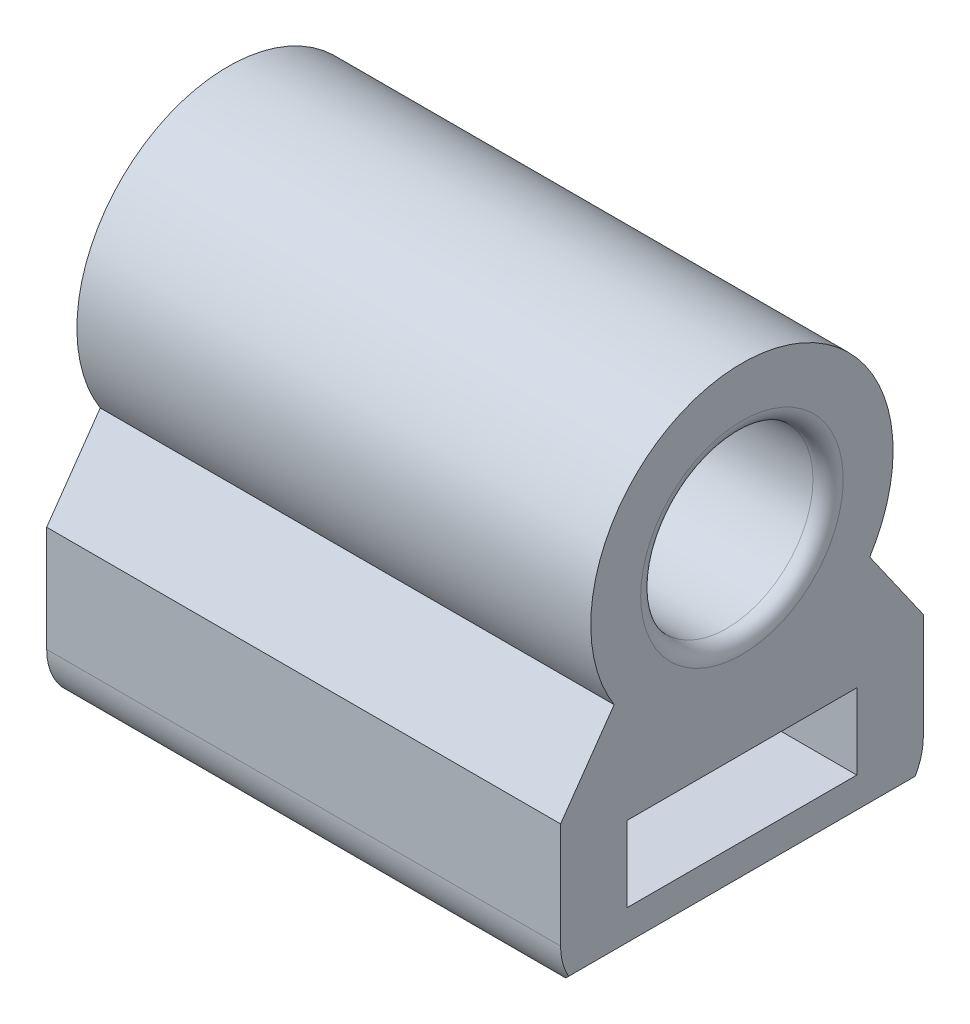
ISO-10303-21;
HEADER;
FILE_DESCRIPTION(('STEP AP214'),'2;1');
FILE_NAME('part.step','',(''),(''),'','','');
FILE_SCHEMA(('AUTOMOTIVE_DESIGN { 1 0 10303 214 1 1 1 1 }'));
ENDSEC;
DATA;
#1=APPLICATION_CONTEXT('core data for automotive mechanical design processes');
#2=APPLICATION_PROTOCOL_DEFINITION('international standard','automotive_design',2000,#1);
#3=PRODUCT_CONTEXT('',#1,'mechanical');
#4=PRODUCT('Part','Part','',(#3));
#5=PRODUCT_RELATED_PRODUCT_CATEGORY('part','',(#4));
#6=PRODUCT_DEFINITION_FORMATION('','',#4);
#7=PRODUCT_DEFINITION_CONTEXT('part definition',#1,'design');
#8=PRODUCT_DEFINITION('design','',#6,#7);
#9=PRODUCT_DEFINITION_SHAPE('','',#8);
#10=(LENGTH_UNIT() NAMED_UNIT(*) SI_UNIT(.MILLI.,.METRE.));
#11=(NAMED_UNIT(*) PLANE_ANGLE_UNIT() SI_UNIT($,.RADIAN.));
#12=(NAMED_UNIT(*) SI_UNIT($,.STERADIAN.) SOLID_ANGLE_UNIT());
#13=UNCERTAINTY_MEASURE_WITH_UNIT(LENGTH_MEASURE(1.E-05),#10,'distance_accuracy_value','');
#14=(GEOMETRIC_REPRESENTATION_CONTEXT(3) GLOBAL_UNCERTAINTY_ASSIGNED_CONTEXT((#13)) GLOBAL_UNIT_ASSIGNED_CONTEXT((#10,
#11,#12)) REPRESENTATION_CONTEXT('',''));
#15=CARTESIAN_POINT('',(0.,0.,0.));
#16=DIRECTION('',(0.,0.,1.));
#17=DIRECTION('',(1.,0.,0.));
#18=AXIS2_PLACEMENT_3D('',#15,#16,#17);
#19=CARTESIAN_POINT('',(0.,2.,0.));
#20=DIRECTION('',(0.,1.,0.));
#21=DIRECTION('',(0.,0.,1.));
#22=AXIS2_PLACEMENT_3D('',#19,#20,#21);
#23=PLANE('',#22);
#24=CARTESIAN_POINT('',(2.5,2.,0.));
#25=DIRECTION('',(0.,1.,0.));
#26=DIRECTION('',(0.,0.,1.));
#27=AXIS2_PLACEMENT_3D('',#24,#25,#26);
#28=CIRCLE('',#27,1.);
#29=CARTESIAN_POINT('',(2.5,2.,1.));
#30=VERTEX_POINT('',#29);
#31=EDGE_CURVE('E209',#30,#30,#28,.T.);
#32=ORIENTED_EDGE('',*,*,#31,.F.);
#33=EDGE_LOOP('',(#32));
#34=FACE_BOUND('',#33,.T.);
#35=CARTESIAN_POINT('',(-2.5,2.,0.));
#36=DIRECTION('',(0.,1.,0.));
#37=DIRECTION('',(0.,0.,1.));
#38=AXIS2_PLACEMENT_3D('',#35,#36,#37);
#39=CIRCLE('',#38,1.);
#40=CARTESIAN_POINT('',(-2.5,2.,1.));
#41=VERTEX_POINT('',#40);
#42=EDGE_CURVE('E212',#41,#41,#39,.T.);
#43=ORIENTED_EDGE('',*,*,#42,.F.);
#44=EDGE_LOOP('',(#43));
#45=FACE_BOUND('',#44,.T.);
#46=DIRECTION('',(0.,0.,1.));
#47=VECTOR('',#46,1.);
#48=CARTESIAN_POINT('',(-11.,2.,0.));
#49=LINE('',#48,#47);
#50=CARTESIAN_POINT('',(-11.,2.,-3.8));
#51=VERTEX_POINT('',#50);
#52=CARTESIAN_POINT('',(-11.,2.,3.8));
#53=VERTEX_POINT('',#52);
#54=EDGE_CURVE('E218',#51,#53,#49,.T.);
#55=ORIENTED_EDGE('',*,*,#54,.T.);
#56=DIRECTION('',(-1.,0.,0.));
#57=VECTOR('',#56,1.);
#58=CARTESIAN_POINT('',(6.,2.,3.8));
#59=LINE('',#58,#57);
#60=CARTESIAN_POINT('',(6.,2.,3.8));
#61=VERTEX_POINT('',#60);
#62=EDGE_CURVE('E191',#61,#53,#59,.T.);
#63=ORIENTED_EDGE('',*,*,#62,.F.);
#64=DIRECTION('',(0.,0.,-1.));
#65=VECTOR('',#64,1.);
#66=CARTESIAN_POINT('',(6.,2.,0.));
#67=LINE('',#66,#65);
#68=CARTESIAN_POINT('',(6.,2.,-3.8));
#69=VERTEX_POINT('',#68);
#70=EDGE_CURVE('E216',#61,#69,#67,.T.);
#71=ORIENTED_EDGE('',*,*,#70,.T.);
#72=DIRECTION('',(1.,0.,0.));
#73=VECTOR('',#72,1.);
#74=CARTESIAN_POINT('',(6.,2.,-3.8));
#75=LINE('',#74,#73);
#76=EDGE_CURVE('E194',#51,#69,#75,.T.);
#77=ORIENTED_EDGE('',*,*,#76,.F.);
#78=EDGE_LOOP('',(#55,#63,#71,#77));
#79=FACE_BOUND('',#78,.T.);
#80=ADVANCED_FACE('F44',(#34,#45,#79),#23,.T.);
#81=CARTESIAN_POINT('',(0.,2.,6.));
#82=DIRECTION('',(0.,0.,-1.));
#83=DIRECTION('',(-1.,0.,0.));
#84=AXIS2_PLACEMENT_3D('',#81,#82,#83);
#85=PLANE('',#84);
#86=DIRECTION('',(0.,-1.,0.));
#87=VECTOR('',#86,1.);
#88=CARTESIAN_POINT('',(-11.,2.,6.));
#89=LINE('',#88,#87);
#90=CARTESIAN_POINT('',(-11.,5.5,6.));
#91=VERTEX_POINT('',#90);
#92=CARTESIAN_POINT('',(-11.,2.,6.));
#93=VERTEX_POINT('',#92);
#94=EDGE_CURVE('E220',#91,#93,#89,.T.);
#95=ORIENTED_EDGE('',*,*,#94,.T.);
#96=DIRECTION('',(1.,0.,0.));
#97=VECTOR('',#96,1.);
#98=CARTESIAN_POINT('',(0.,2.,6.));
#99=LINE('',#98,#97);
#100=CARTESIAN_POINT('',(6.,2.,6.));
#101=VERTEX_POINT('',#100);
#102=EDGE_CURVE('E11',#93,#101,#99,.T.);
#103=ORIENTED_EDGE('',*,*,#102,.T.);
#104=DIRECTION('',(0.,-1.,0.));
#105=VECTOR('',#104,1.);
#106=CARTESIAN_POINT('',(6.,2.,6.));
#107=LINE('',#106,#105);
#108=CARTESIAN_POINT('',(6.,5.5,6.));
#109=VERTEX_POINT('',#108);
#110=EDGE_CURVE('E232',#109,#101,#107,.T.);
#111=ORIENTED_EDGE('',*,*,#110,.F.);
#112=DIRECTION('',(1.,0.,0.));
#113=VECTOR('',#112,1.);
#114=CARTESIAN_POINT('',(-27.4146276229466,5.5,6.));
#115=LINE('',#114,#113);
#116=EDGE_CURVE('E152',#91,#109,#115,.T.);
#117=ORIENTED_EDGE('',*,*,#116,.F.);
#118=EDGE_LOOP('',(#95,#103,#111,#117));
#119=FACE_BOUND('',#118,.T.);
#120=ADVANCED_FACE('F284',(#119),#85,.F.);
#121=CARTESIAN_POINT('',(6.,2.,0.));
#122=DIRECTION('',(-1.,0.,0.));
#123=DIRECTION('',(0.,0.,1.));
#124=AXIS2_PLACEMENT_3D('',#121,#122,#123);
#125=PLANE('',#124);
#126=CARTESIAN_POINT('',(6.,10.7,0.));
#127=DIRECTION('',(-1.,0.,0.));
#128=DIRECTION('',(0.,0.,1.));
#129=AXIS2_PLACEMENT_3D('',#126,#127,#128);
#130=CIRCLE('',#129,3.35);
#131=CARTESIAN_POINT('',(6.,10.7,3.35));
#132=VERTEX_POINT('',#131);
#133=EDGE_CURVE('E240',#132,#132,#130,.T.);
#134=ORIENTED_EDGE('',*,*,#133,.T.);
#135=EDGE_LOOP('',(#134));
#136=FACE_BOUND('',#135,.T.);
#137=DIRECTION('',(0.,0.,-1.));
#138=VECTOR('',#137,1.);
#139=CARTESIAN_POINT('',(6.,1.,0.));
#140=LINE('',#139,#138);
#141=CARTESIAN_POINT('',(6.,1.,5.73205080756888));
#142=VERTEX_POINT('',#141);
#143=CARTESIAN_POINT('',(6.,1.,-5.73205080756888));
#144=VERTEX_POINT('',#143);
#145=EDGE_CURVE('E246',#142,#144,#140,.T.);
#146=ORIENTED_EDGE('',*,*,#145,.T.);
#147=CARTESIAN_POINT('',(6.,2.,-4.));
#148=DIRECTION('',(-1.,0.,0.));
#149=DIRECTION('',(0.,0.,1.));
#150=AXIS2_PLACEMENT_3D('',#147,#148,#149);
#151=CIRCLE('',#150,2.);
#152=CARTESIAN_POINT('',(6.,2.,-6.));
#153=VERTEX_POINT('',#152);
#154=EDGE_CURVE('E262',#144,#153,#151,.F.);
#155=ORIENTED_EDGE('',*,*,#154,.T.);
#156=DIRECTION('',(0.,-1.,0.));
#157=VECTOR('',#156,1.);
#158=CARTESIAN_POINT('',(6.,2.,-6.));
#159=LINE('',#158,#157);
#160=CARTESIAN_POINT('',(6.,5.5,-6.));
#161=VERTEX_POINT('',#160);
#162=EDGE_CURVE('E230',#161,#153,#159,.T.);
#163=ORIENTED_EDGE('',*,*,#162,.F.);
#164=DIRECTION('',(0.,0.819152044288991,0.573576436351047));
#165=VECTOR('',#164,1.);
#166=CARTESIAN_POINT('',(6.,4.62852246821214,-6.61021513713825));
#167=LINE('',#166,#165);
#168=CARTESIAN_POINT('',(6.,8.03079039698591,-4.22792148640172));
#169=VERTEX_POINT('',#168);
#170=EDGE_CURVE('E153',#161,#169,#167,.T.);
#171=ORIENTED_EDGE('',*,*,#170,.T.);
#172=CARTESIAN_POINT('',(6.,10.7,0.));
#173=DIRECTION('',(1.,0.,0.));
#174=DIRECTION('',(0.,0.,-1.));
#175=AXIS2_PLACEMENT_3D('',#172,#173,#174);
#176=CIRCLE('',#175,5.);
#177=CARTESIAN_POINT('',(6.,8.03079039698591,4.22792148640172));
#178=VERTEX_POINT('',#177);
#179=EDGE_CURVE('E147',#169,#178,#176,.T.);
#180=ORIENTED_EDGE('',*,*,#179,.T.);
#181=DIRECTION('',(0.,0.819152044288991,-0.573576436351047));
#182=VECTOR('',#181,1.);
#183=CARTESIAN_POINT('',(6.,4.62852246821214,6.61021513713825));
#184=LINE('',#183,#182);
#185=EDGE_CURVE('E157',#109,#178,#184,.T.);
#186=ORIENTED_EDGE('',*,*,#185,.F.);
#187=ORIENTED_EDGE('',*,*,#110,.T.);
#188=CARTESIAN_POINT('',(6.,2.,4.));
#189=DIRECTION('',(-1.,0.,0.));
#190=DIRECTION('',(0.,0.,1.));
#191=AXIS2_PLACEMENT_3D('',#188,#189,#190);
#192=CIRCLE('',#191,2.);
#193=EDGE_CURVE('E260',#101,#142,#192,.F.);
#194=ORIENTED_EDGE('',*,*,#193,.T.);
#195=EDGE_LOOP('',(#146,#155,#163,#171,#180,#186,#187,#194));
#196=FACE_BOUND('',#195,.T.);
#197=DIRECTION('',(0.,0.,-1.));
#198=VECTOR('',#197,1.);
#199=CARTESIAN_POINT('',(6.,4.5,0.));
#200=LINE('',#199,#198);
#201=CARTESIAN_POINT('',(6.,4.5,3.8));
#202=VERTEX_POINT('',#201);
#203=CARTESIAN_POINT('',(6.,4.5,-3.8));
#204=VERTEX_POINT('',#203);
#205=EDGE_CURVE('E162',#202,#204,#200,.T.);
#206=ORIENTED_EDGE('',*,*,#205,.T.);
#207=DIRECTION('',(0.,-1.,0.));
#208=VECTOR('',#207,1.);
#209=CARTESIAN_POINT('',(6.,4.5,-3.8));
#210=LINE('',#209,#208);
#211=EDGE_CURVE('E200',#204,#69,#210,.T.);
#212=ORIENTED_EDGE('',*,*,#211,.T.);
#213=ORIENTED_EDGE('',*,*,#70,.F.);
#214=DIRECTION('',(0.,-1.,0.));
#215=VECTOR('',#214,1.);
#216=CARTESIAN_POINT('',(6.,4.5,3.8));
#217=LINE('',#216,#215);
#218=EDGE_CURVE('E184',#202,#61,#217,.T.);
#219=ORIENTED_EDGE('',*,*,#218,.F.);
#220=EDGE_LOOP('',(#206,#212,#213,#219));
#221=FACE_BOUND('',#220,.T.);
#222=ADVANCED_FACE('F165',(#136,#196,#221),#125,.F.);
#223=CARTESIAN_POINT('',(0.,2.,-6.));
#224=DIRECTION('',(0.,0.,-1.));
#225=DIRECTION('',(-1.,0.,0.));
#226=AXIS2_PLACEMENT_3D('',#223,#224,#225);
#227=PLANE('',#226);
#228=ORIENTED_EDGE('',*,*,#162,.T.);
#229=DIRECTION('',(1.,0.,0.));
#230=VECTOR('',#229,1.);
#231=CARTESIAN_POINT('',(-11.,2.,-6.));
#232=LINE('',#231,#230);
#233=CARTESIAN_POINT('',(-11.,2.,-6.));
#234=VERTEX_POINT('',#233);
#235=EDGE_CURVE('E67',#153,#234,#232,.F.);
#236=ORIENTED_EDGE('',*,*,#235,.T.);
#237=DIRECTION('',(0.,-1.,0.));
#238=VECTOR('',#237,1.);
#239=CARTESIAN_POINT('',(-11.,2.,-6.));
#240=LINE('',#239,#238);
#241=CARTESIAN_POINT('',(-11.,5.5,-6.));
#242=VERTEX_POINT('',#241);
#243=EDGE_CURVE('E228',#242,#234,#240,.T.);
#244=ORIENTED_EDGE('',*,*,#243,.F.);
#245=DIRECTION('',(1.,0.,0.));
#246=VECTOR('',#245,1.);
#247=CARTESIAN_POINT('',(-27.4146276229466,5.5,-6.));
#248=LINE('',#247,#246);
#249=EDGE_CURVE('E178',#242,#161,#248,.T.);
#250=ORIENTED_EDGE('',*,*,#249,.T.);
#251=EDGE_LOOP('',(#228,#236,#244,#250));
#252=FACE_BOUND('',#251,.T.);
#253=ADVANCED_FACE('F329',(#252),#227,.T.);
#254=CARTESIAN_POINT('',(-2.5,2.,0.));
#255=DIRECTION('',(0.,-1.,0.));
#256=DIRECTION('',(0.,0.,-1.));
#257=AXIS2_PLACEMENT_3D('',#254,#255,#256);
#258=CYLINDRICAL_SURFACE('',#257,1.);
#259=ORIENTED_EDGE('',*,*,#42,.T.);
#260=EDGE_LOOP('',(#259));
#261=FACE_BOUND('',#260,.T.);
#262=CARTESIAN_POINT('',(-2.5,0.,0.));
#263=DIRECTION('',(0.,1.,0.));
#264=DIRECTION('',(0.,0.,1.));
#265=AXIS2_PLACEMENT_3D('',#262,#263,#264);
#266=CIRCLE('',#265,1.);
#267=CARTESIAN_POINT('',(-2.5,0.,1.));
#268=VERTEX_POINT('',#267);
#269=EDGE_CURVE('E223',#268,#268,#266,.T.);
#270=ORIENTED_EDGE('',*,*,#269,.F.);
#271=EDGE_LOOP('',(#270));
#272=FACE_BOUND('',#271,.T.);
#273=ADVANCED_FACE('F332',(#261,#272),#258,.F.);
#274=CARTESIAN_POINT('',(2.5,2.,0.));
#275=DIRECTION('',(0.,-1.,0.));
#276=DIRECTION('',(0.,0.,-1.));
#277=AXIS2_PLACEMENT_3D('',#274,#275,#276);
#278=CYLINDRICAL_SURFACE('',#277,1.);
#279=ORIENTED_EDGE('',*,*,#31,.T.);
#280=EDGE_LOOP('',(#279));
#281=FACE_BOUND('',#280,.T.);
#282=CARTESIAN_POINT('',(2.5,0.,0.));
#283=DIRECTION('',(0.,1.,0.));
#284=DIRECTION('',(0.,0.,1.));
#285=AXIS2_PLACEMENT_3D('',#282,#283,#284);
#286=CIRCLE('',#285,1.);
#287=CARTESIAN_POINT('',(2.5,0.,1.));
#288=VERTEX_POINT('',#287);
#289=EDGE_CURVE('E208',#288,#288,#286,.T.);
#290=ORIENTED_EDGE('',*,*,#289,.F.);
#291=EDGE_LOOP('',(#290));
#292=FACE_BOUND('',#291,.T.);
#293=ADVANCED_FACE('F327',(#281,#292),#278,.F.);
#294=CARTESIAN_POINT('',(-11.,2.,0.));
#295=DIRECTION('',(1.,0.,0.));
#296=DIRECTION('',(0.,0.,-1.));
#297=AXIS2_PLACEMENT_3D('',#294,#295,#296);
#298=PLANE('',#297);
#299=CARTESIAN_POINT('',(-11.,10.7,0.));
#300=DIRECTION('',(1.,0.,0.));
#301=DIRECTION('',(0.,0.,-1.));
#302=AXIS2_PLACEMENT_3D('',#299,#300,#301);
#303=CIRCLE('',#302,3.35);
#304=CARTESIAN_POINT('',(-11.,10.7,-3.35));
#305=VERTEX_POINT('',#304);
#306=EDGE_CURVE('E243',#305,#305,#303,.T.);
#307=ORIENTED_EDGE('',*,*,#306,.T.);
#308=EDGE_LOOP('',(#307));
#309=FACE_BOUND('',#308,.T.);
#310=DIRECTION('',(0.,-1.,0.));
#311=VECTOR('',#310,1.);
#312=CARTESIAN_POINT('',(-11.,4.5,-3.8));
#313=LINE('',#312,#311);
#314=CARTESIAN_POINT('',(-11.,4.5,-3.8));
#315=VERTEX_POINT('',#314);
#316=EDGE_CURVE('E205',#315,#51,#313,.T.);
#317=ORIENTED_EDGE('',*,*,#316,.F.);
#318=DIRECTION('',(0.,0.,1.));
#319=VECTOR('',#318,1.);
#320=CARTESIAN_POINT('',(-11.,4.5,0.));
#321=LINE('',#320,#319);
#322=CARTESIAN_POINT('',(-11.,4.5,3.8));
#323=VERTEX_POINT('',#322);
#324=EDGE_CURVE('E183',#315,#323,#321,.T.);
#325=ORIENTED_EDGE('',*,*,#324,.T.);
#326=DIRECTION('',(0.,-1.,0.));
#327=VECTOR('',#326,1.);
#328=CARTESIAN_POINT('',(-11.,4.5,3.8));
#329=LINE('',#328,#327);
#330=EDGE_CURVE('E187',#323,#53,#329,.T.);
#331=ORIENTED_EDGE('',*,*,#330,.T.);
#332=ORIENTED_EDGE('',*,*,#54,.F.);
#333=EDGE_LOOP('',(#317,#325,#331,#332));
#334=FACE_BOUND('',#333,.T.);
#335=ORIENTED_EDGE('',*,*,#243,.T.);
#336=CARTESIAN_POINT('',(-11.,2.,-4.));
#337=DIRECTION('',(1.,0.,0.));
#338=DIRECTION('',(0.,0.,-1.));
#339=AXIS2_PLACEMENT_3D('',#336,#337,#338);
#340=CIRCLE('',#339,2.);
#341=CARTESIAN_POINT('',(-11.,0.,-4.));
#342=VERTEX_POINT('',#341);
#343=EDGE_CURVE('E52',#234,#342,#340,.F.);
#344=ORIENTED_EDGE('',*,*,#343,.T.);
#345=DIRECTION('',(0.,0.,1.));
#346=VECTOR('',#345,1.);
#347=CARTESIAN_POINT('',(-11.,0.,0.));
#348=LINE('',#347,#346);
#349=CARTESIAN_POINT('',(-11.,0.,4.));
#350=VERTEX_POINT('',#349);
#351=EDGE_CURVE('E213',#342,#350,#348,.T.);
#352=ORIENTED_EDGE('',*,*,#351,.T.);
#353=CARTESIAN_POINT('',(-11.,2.,4.));
#354=DIRECTION('',(1.,0.,0.));
#355=DIRECTION('',(0.,0.,-1.));
#356=AXIS2_PLACEMENT_3D('',#353,#354,#355);
#357=CIRCLE('',#356,2.);
#358=EDGE_CURVE('E59',#350,#93,#357,.F.);
#359=ORIENTED_EDGE('',*,*,#358,.T.);
#360=ORIENTED_EDGE('',*,*,#94,.F.);
#361=DIRECTION('',(0.,-0.819152044288991,0.573576436351047));
#362=VECTOR('',#361,1.);
#363=CARTESIAN_POINT('',(-11.,4.62852246821214,6.61021513713825));
#364=LINE('',#363,#362);
#365=CARTESIAN_POINT('',(-11.,8.03079039698591,4.22792148640172));
#366=VERTEX_POINT('',#365);
#367=EDGE_CURVE('E177',#366,#91,#364,.T.);
#368=ORIENTED_EDGE('',*,*,#367,.F.);
#369=CARTESIAN_POINT('',(-11.,10.7,0.));
#370=DIRECTION('',(1.,0.,0.));
#371=DIRECTION('',(0.,0.,-1.));
#372=AXIS2_PLACEMENT_3D('',#369,#370,#371);
#373=CIRCLE('',#372,5.);
#374=CARTESIAN_POINT('',(-11.,8.03079039698591,-4.22792148640172));
#375=VERTEX_POINT('',#374);
#376=EDGE_CURVE('E149',#366,#375,#373,.F.);
#377=ORIENTED_EDGE('',*,*,#376,.T.);
#378=DIRECTION('',(0.,-0.819152044288991,-0.573576436351047));
#379=VECTOR('',#378,1.);
#380=CARTESIAN_POINT('',(-11.,4.62852246821214,-6.61021513713825));
#381=LINE('',#380,#379);
#382=EDGE_CURVE('E286',#375,#242,#381,.T.);
#383=ORIENTED_EDGE('',*,*,#382,.T.);
#384=EDGE_LOOP('',(#335,#344,#352,#359,#360,#368,#377,#383));
#385=FACE_BOUND('',#384,.T.);
#386=ADVANCED_FACE('F267',(#309,#334,#385),#298,.F.);
#387=CARTESIAN_POINT('',(0.,0.,0.));
#388=DIRECTION('',(0.,1.,0.));
#389=DIRECTION('',(0.,0.,1.));
#390=AXIS2_PLACEMENT_3D('',#387,#388,#389);
#391=PLANE('',#390);
#392=ORIENTED_EDGE('',*,*,#289,.T.);
#393=EDGE_LOOP('',(#392));
#394=FACE_BOUND('',#393,.T.);
#395=ORIENTED_EDGE('',*,*,#269,.T.);
#396=EDGE_LOOP('',(#395));
#397=FACE_BOUND('',#396,.T.);
#398=ORIENTED_EDGE('',*,*,#351,.F.);
#399=DIRECTION('',(1.,0.,0.));
#400=VECTOR('',#399,1.);
#401=CARTESIAN_POINT('',(5.,0.,-4.));
#402=LINE('',#401,#400);
#403=CARTESIAN_POINT('',(5.,0.,-4.));
#404=VERTEX_POINT('',#403);
#405=EDGE_CURVE('E253',#342,#404,#402,.T.);
#406=ORIENTED_EDGE('',*,*,#405,.T.);
#407=DIRECTION('',(0.,0.,1.));
#408=VECTOR('',#407,1.);
#409=CARTESIAN_POINT('',(5.,0.,0.));
#410=LINE('',#409,#408);
#411=CARTESIAN_POINT('',(5.,0.,4.));
#412=VERTEX_POINT('',#411);
#413=EDGE_CURVE('E248',#404,#412,#410,.T.);
#414=ORIENTED_EDGE('',*,*,#413,.T.);
#415=DIRECTION('',(1.,0.,0.));
#416=VECTOR('',#415,1.);
#417=CARTESIAN_POINT('',(0.,0.,4.));
#418=LINE('',#417,#416);
#419=EDGE_CURVE('E251',#412,#350,#418,.F.);
#420=ORIENTED_EDGE('',*,*,#419,.T.);
#421=EDGE_LOOP('',(#398,#406,#414,#420));
#422=FACE_BOUND('',#421,.T.);
#423=ADVANCED_FACE('F272',(#394,#397,#422),#391,.F.);
#424=CARTESIAN_POINT('',(6.,4.5,-3.8));
#425=DIRECTION('',(0.,0.,-1.));
#426=DIRECTION('',(-1.,0.,0.));
#427=AXIS2_PLACEMENT_3D('',#424,#425,#426);
#428=PLANE('',#427);
#429=ORIENTED_EDGE('',*,*,#76,.T.);
#430=ORIENTED_EDGE('',*,*,#211,.F.);
#431=DIRECTION('',(1.,0.,0.));
#432=VECTOR('',#431,1.);
#433=CARTESIAN_POINT('',(6.,4.5,-3.8));
#434=LINE('',#433,#432);
#435=EDGE_CURVE('E197',#315,#204,#434,.T.);
#436=ORIENTED_EDGE('',*,*,#435,.F.);
#437=ORIENTED_EDGE('',*,*,#316,.T.);
#438=EDGE_LOOP('',(#429,#430,#436,#437));
#439=FACE_BOUND('',#438,.T.);
#440=ADVANCED_FACE('F305',(#439),#428,.F.);
#441=CARTESIAN_POINT('',(6.,4.5,3.8));
#442=DIRECTION('',(0.,0.,1.));
#443=DIRECTION('',(1.,0.,0.));
#444=AXIS2_PLACEMENT_3D('',#441,#442,#443);
#445=PLANE('',#444);
#446=ORIENTED_EDGE('',*,*,#62,.T.);
#447=ORIENTED_EDGE('',*,*,#330,.F.);
#448=DIRECTION('',(-1.,0.,0.));
#449=VECTOR('',#448,1.);
#450=CARTESIAN_POINT('',(6.,4.5,3.8));
#451=LINE('',#450,#449);
#452=EDGE_CURVE('E190',#202,#323,#451,.T.);
#453=ORIENTED_EDGE('',*,*,#452,.F.);
#454=ORIENTED_EDGE('',*,*,#218,.T.);
#455=EDGE_LOOP('',(#446,#447,#453,#454));
#456=FACE_BOUND('',#455,.T.);
#457=ADVANCED_FACE('F301',(#456),#445,.F.);
#458=CARTESIAN_POINT('',(-27.4146276229466,4.5,0.));
#459=DIRECTION('',(0.,-1.,0.));
#460=DIRECTION('',(0.,0.,-1.));
#461=AXIS2_PLACEMENT_3D('',#458,#459,#460);
#462=PLANE('',#461);
#463=ORIENTED_EDGE('',*,*,#435,.T.);
#464=ORIENTED_EDGE('',*,*,#205,.F.);
#465=ORIENTED_EDGE('',*,*,#452,.T.);
#466=ORIENTED_EDGE('',*,*,#324,.F.);
#467=EDGE_LOOP('',(#463,#464,#465,#466));
#468=FACE_BOUND('',#467,.T.);
#469=ADVANCED_FACE('F297',(#468),#462,.T.);
#470=CARTESIAN_POINT('',(-27.4146276229466,10.7,0.));
#471=DIRECTION('',(1.,0.,0.));
#472=DIRECTION('',(0.,0.,-1.));
#473=AXIS2_PLACEMENT_3D('',#470,#471,#472);
#474=CYLINDRICAL_SURFACE('',#473,2.85);
#475=CARTESIAN_POINT('',(5.5,10.7,0.));
#476=DIRECTION('',(-1.,0.,0.));
#477=DIRECTION('',(0.,0.,1.));
#478=AXIS2_PLACEMENT_3D('',#475,#476,#477);
#479=CIRCLE('',#478,2.85);
#480=CARTESIAN_POINT('',(5.5,10.7,2.85));
#481=VERTEX_POINT('',#480);
#482=EDGE_CURVE('E237',#481,#481,#479,.F.);
#483=ORIENTED_EDGE('',*,*,#482,.T.);
#484=EDGE_LOOP('',(#483));
#485=FACE_BOUND('',#484,.T.);
#486=CARTESIAN_POINT('',(-10.5,10.7,0.));
#487=DIRECTION('',(1.,0.,0.));
#488=DIRECTION('',(0.,0.,-1.));
#489=AXIS2_PLACEMENT_3D('',#486,#487,#488);
#490=CIRCLE('',#489,2.85);
#491=CARTESIAN_POINT('',(-10.5,10.7,-2.85));
#492=VERTEX_POINT('',#491);
#493=EDGE_CURVE('E234',#492,#492,#490,.F.);
#494=ORIENTED_EDGE('',*,*,#493,.T.);
#495=EDGE_LOOP('',(#494));
#496=FACE_BOUND('',#495,.T.);
#497=ADVANCED_FACE('F433',(#485,#496),#474,.F.);
#498=CARTESIAN_POINT('',(-27.4146276229466,4.62852246821214,6.61021513713825));
#499=DIRECTION('',(0.,-0.573576436351047,-0.819152044288991));
#500=DIRECTION('',(0.,0.819152044288991,-0.573576436351047));
#501=AXIS2_PLACEMENT_3D('',#498,#499,#500);
#502=PLANE('',#501);
#503=DIRECTION('',(1.,0.,0.));
#504=VECTOR('',#503,1.);
#505=CARTESIAN_POINT('',(-27.4146276229466,8.03079039698591,4.22792148640172));
#506=LINE('',#505,#504);
#507=EDGE_CURVE('E142',#366,#178,#506,.T.);
#508=ORIENTED_EDGE('',*,*,#507,.F.);
#509=ORIENTED_EDGE('',*,*,#367,.T.);
#510=ORIENTED_EDGE('',*,*,#116,.T.);
#511=ORIENTED_EDGE('',*,*,#185,.T.);
#512=EDGE_LOOP('',(#508,#509,#510,#511));
#513=FACE_BOUND('',#512,.T.);
#514=ADVANCED_FACE('F158',(#513),#502,.F.);
#515=CARTESIAN_POINT('',(-27.4146276229466,4.62852246821214,-6.61021513713825));
#516=DIRECTION('',(0.,0.573576436351047,-0.819152044288991));
#517=DIRECTION('',(0.,0.819152044288991,0.573576436351047));
#518=AXIS2_PLACEMENT_3D('',#515,#516,#517);
#519=PLANE('',#518);
#520=ORIENTED_EDGE('',*,*,#382,.F.);
#521=DIRECTION('',(1.,0.,0.));
#522=VECTOR('',#521,1.);
#523=CARTESIAN_POINT('',(-27.4146276229466,8.03079039698591,-4.22792148640172));
#524=LINE('',#523,#522);
#525=EDGE_CURVE('E175',#375,#169,#524,.T.);
#526=ORIENTED_EDGE('',*,*,#525,.T.);
#527=ORIENTED_EDGE('',*,*,#170,.F.);
#528=ORIENTED_EDGE('',*,*,#249,.F.);
#529=EDGE_LOOP('',(#520,#526,#527,#528));
#530=FACE_BOUND('',#529,.T.);
#531=ADVANCED_FACE('F289',(#530),#519,.T.);
#532=CARTESIAN_POINT('',(-27.4146276229466,10.7,0.));
#533=DIRECTION('',(1.,0.,0.));
#534=DIRECTION('',(0.,0.,-1.));
#535=AXIS2_PLACEMENT_3D('',#532,#533,#534);
#536=CYLINDRICAL_SURFACE('',#535,5.);
#537=ORIENTED_EDGE('',*,*,#376,.F.);
#538=ORIENTED_EDGE('',*,*,#507,.T.);
#539=ORIENTED_EDGE('',*,*,#179,.F.);
#540=ORIENTED_EDGE('',*,*,#525,.F.);
#541=EDGE_LOOP('',(#537,#538,#539,#540));
#542=FACE_BOUND('',#541,.T.);
#543=ADVANCED_FACE('F144',(#542),#536,.T.);
#544=CARTESIAN_POINT('',(5.5,10.7,0.));
#545=DIRECTION('',(-1.,0.,0.));
#546=DIRECTION('',(0.,0.,1.));
#547=AXIS2_PLACEMENT_3D('',#544,#545,#546);
#548=TOROIDAL_SURFACE('',#547,3.35,0.5);
#549=ORIENTED_EDGE('',*,*,#133,.F.);
#550=EDGE_LOOP('',(#549));
#551=FACE_BOUND('',#550,.T.);
#552=ORIENTED_EDGE('',*,*,#482,.F.);
#553=EDGE_LOOP('',(#552));
#554=FACE_BOUND('',#553,.T.);
#555=ADVANCED_FACE('F342',(#551,#554),#548,.T.);
#556=CARTESIAN_POINT('',(-10.5,10.7,0.));
#557=DIRECTION('',(1.,0.,0.));
#558=DIRECTION('',(0.,0.,-1.));
#559=AXIS2_PLACEMENT_3D('',#556,#557,#558);
#560=TOROIDAL_SURFACE('',#559,3.35,0.5);
#561=ORIENTED_EDGE('',*,*,#306,.F.);
#562=EDGE_LOOP('',(#561));
#563=FACE_BOUND('',#562,.T.);
#564=ORIENTED_EDGE('',*,*,#493,.F.);
#565=EDGE_LOOP('',(#564));
#566=FACE_BOUND('',#565,.T.);
#567=ADVANCED_FACE('F345',(#563,#566),#560,.T.);
#568=CARTESIAN_POINT('',(6.,1.,0.));
#569=DIRECTION('',(-0.707106781186547,0.707106781186547,0.));
#570=DIRECTION('',(0.,0.,-1.));
#571=AXIS2_PLACEMENT_3D('',#568,#569,#570);
#572=PLANE('',#571);
#573=ORIENTED_EDGE('',*,*,#413,.F.);
#574=CARTESIAN_POINT('',(7.,2.,-4.));
#575=DIRECTION('',(-0.707106781186547,0.707106781186547,0.));
#576=DIRECTION('',(-0.707106781186548,-0.707106781186548,0.));
#577=AXIS2_PLACEMENT_3D('',#574,#575,#576);
#578=ELLIPSE('',#577,2.82842712474619,2.);
#579=EDGE_CURVE('E258',#404,#144,#578,.F.);
#580=ORIENTED_EDGE('',*,*,#579,.T.);
#581=ORIENTED_EDGE('',*,*,#145,.F.);
#582=CARTESIAN_POINT('',(7.,2.,4.));
#583=DIRECTION('',(-0.707106781186547,0.707106781186547,0.));
#584=DIRECTION('',(0.707106781186548,0.707106781186548,0.));
#585=AXIS2_PLACEMENT_3D('',#582,#583,#584);
#586=ELLIPSE('',#585,2.82842712474619,2.);
#587=EDGE_CURVE('E256',#142,#412,#586,.F.);
#588=ORIENTED_EDGE('',*,*,#587,.T.);
#589=EDGE_LOOP('',(#573,#580,#581,#588));
#590=FACE_BOUND('',#589,.T.);
#591=ADVANCED_FACE('F279',(#590),#572,.F.);
#592=CARTESIAN_POINT('',(0.,2.,-4.));
#593=DIRECTION('',(-1.,0.,0.));
#594=DIRECTION('',(0.,0.,1.));
#595=AXIS2_PLACEMENT_3D('',#592,#593,#594);
#596=CYLINDRICAL_SURFACE('',#595,2.);
#597=ORIENTED_EDGE('',*,*,#343,.F.);
#598=ORIENTED_EDGE('',*,*,#235,.F.);
#599=ORIENTED_EDGE('',*,*,#154,.F.);
#600=ORIENTED_EDGE('',*,*,#579,.F.);
#601=ORIENTED_EDGE('',*,*,#405,.F.);
#602=EDGE_LOOP('',(#597,#598,#599,#600,#601));
#603=FACE_BOUND('',#602,.T.);
#604=ADVANCED_FACE('F275',(#603),#596,.T.);
#605=CARTESIAN_POINT('',(0.,2.,4.));
#606=DIRECTION('',(1.,0.,0.));
#607=DIRECTION('',(0.,0.,-1.));
#608=AXIS2_PLACEMENT_3D('',#605,#606,#607);
#609=CYLINDRICAL_SURFACE('',#608,2.);
#610=ORIENTED_EDGE('',*,*,#358,.F.);
#611=ORIENTED_EDGE('',*,*,#419,.F.);
#612=ORIENTED_EDGE('',*,*,#587,.F.);
#613=ORIENTED_EDGE('',*,*,#193,.F.);
#614=ORIENTED_EDGE('',*,*,#102,.F.);
#615=EDGE_LOOP('',(#610,#611,#612,#613,#614));
#616=FACE_BOUND('',#615,.T.);
#617=ADVANCED_FACE('F46',(#616),#609,.T.);
#618=CLOSED_SHELL('',(#80,#120,#222,#253,#273,#293,#386,#423,#440,#457,#469,#497,#514,#531,#543,
#555,#567,#591,#604,#617));
#619=MANIFOLD_SOLID_BREP('B2',#618);
#620=ADVANCED_BREP_SHAPE_REPRESENTATION('',(#18,#619),#14);
#621=SHAPE_DEFINITION_REPRESENTATION(#9,#620);
ENDSEC;
END-ISO-10303-21;
